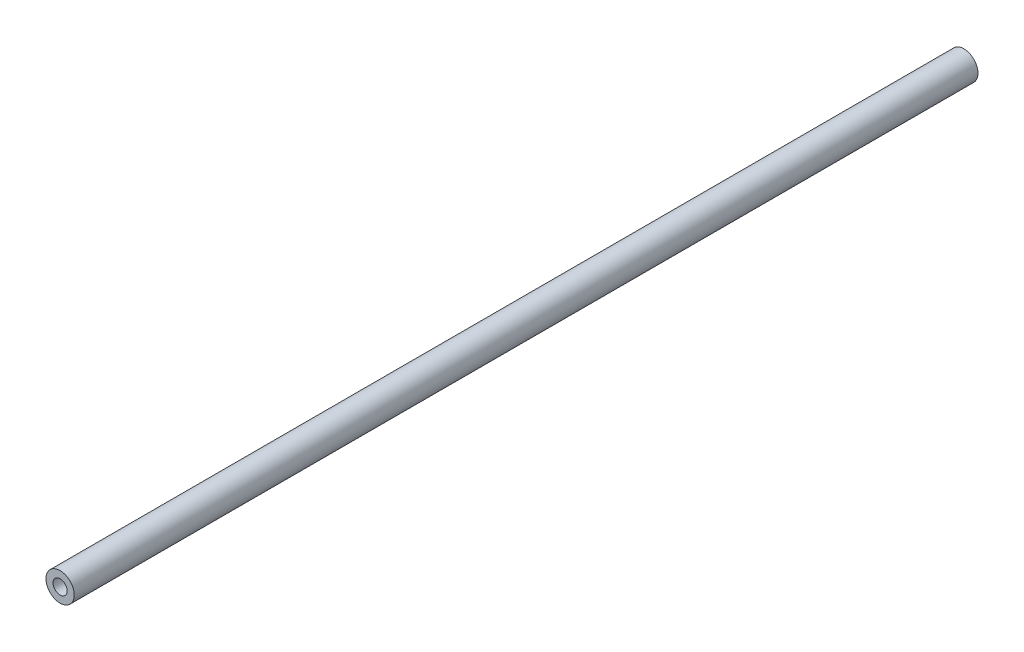
ISO-10303-21;
HEADER;
FILE_DESCRIPTION(('STEP AP214'),'2;1');
FILE_NAME('part.step','',(''),(''),'','','');
FILE_SCHEMA(('AUTOMOTIVE_DESIGN { 1 0 10303 214 1 1 1 1 }'));
ENDSEC;
DATA;
#1=APPLICATION_CONTEXT('core data for automotive mechanical design processes');
#2=APPLICATION_PROTOCOL_DEFINITION('international standard','automotive_design',2000,#1);
#3=PRODUCT_CONTEXT('',#1,'mechanical');
#4=PRODUCT('Part','Part','',(#3));
#5=PRODUCT_RELATED_PRODUCT_CATEGORY('part','',(#4));
#6=PRODUCT_DEFINITION_FORMATION('','',#4);
#7=PRODUCT_DEFINITION_CONTEXT('part definition',#1,'design');
#8=PRODUCT_DEFINITION('design','',#6,#7);
#9=PRODUCT_DEFINITION_SHAPE('','',#8);
#10=(LENGTH_UNIT() NAMED_UNIT(*) SI_UNIT(.MILLI.,.METRE.));
#11=(NAMED_UNIT(*) PLANE_ANGLE_UNIT() SI_UNIT($,.RADIAN.));
#12=(NAMED_UNIT(*) SI_UNIT($,.STERADIAN.) SOLID_ANGLE_UNIT());
#13=UNCERTAINTY_MEASURE_WITH_UNIT(LENGTH_MEASURE(1.E-05),#10,'distance_accuracy_value','');
#14=(GEOMETRIC_REPRESENTATION_CONTEXT(3) GLOBAL_UNCERTAINTY_ASSIGNED_CONTEXT((#13)) GLOBAL_UNIT_ASSIGNED_CONTEXT((#10,
#11,#12)) REPRESENTATION_CONTEXT('',''));
#15=CARTESIAN_POINT('',(0.,0.,0.));
#16=DIRECTION('',(0.,0.,1.));
#17=DIRECTION('',(1.,0.,0.));
#18=AXIS2_PLACEMENT_3D('',#15,#16,#17);
#19=CARTESIAN_POINT('',(0.,0.,406.4));
#20=DIRECTION('',(0.,0.,1.));
#21=DIRECTION('',(1.,0.,0.));
#22=AXIS2_PLACEMENT_3D('',#19,#20,#21);
#23=PLANE('',#22);
#24=CARTESIAN_POINT('',(0.,0.,406.4));
#25=DIRECTION('',(0.,0.,1.));
#26=DIRECTION('',(1.,0.,0.));
#27=AXIS2_PLACEMENT_3D('',#24,#25,#26);
#28=CIRCLE('',#27,6.35);
#29=CARTESIAN_POINT('',(6.35,0.,406.4));
#30=VERTEX_POINT('',#29);
#31=EDGE_CURVE('E10',#30,#30,#28,.T.);
#32=ORIENTED_EDGE('',*,*,#31,.T.);
#33=EDGE_LOOP('',(#32));
#34=FACE_BOUND('',#33,.T.);
#35=CARTESIAN_POINT('',(0.,0.,406.4));
#36=DIRECTION('',(0.,0.,1.));
#37=DIRECTION('',(1.,0.,0.));
#38=AXIS2_PLACEMENT_3D('',#35,#36,#37);
#39=CIRCLE('',#38,3.175);
#40=CARTESIAN_POINT('',(3.175,0.,406.4));
#41=VERTEX_POINT('',#40);
#42=EDGE_CURVE('E42',#41,#41,#39,.T.);
#43=ORIENTED_EDGE('',*,*,#42,.F.);
#44=EDGE_LOOP('',(#43));
#45=FACE_BOUND('',#44,.T.);
#46=ADVANCED_FACE('F31',(#34,#45),#23,.T.);
#47=CARTESIAN_POINT('',(0.,0.,0.));
#48=DIRECTION('',(0.,0.,1.));
#49=DIRECTION('',(1.,0.,0.));
#50=AXIS2_PLACEMENT_3D('',#47,#48,#49);
#51=PLANE('',#50);
#52=CARTESIAN_POINT('',(0.,0.,0.));
#53=DIRECTION('',(0.,0.,1.));
#54=DIRECTION('',(1.,0.,0.));
#55=AXIS2_PLACEMENT_3D('',#52,#53,#54);
#56=CIRCLE('',#55,6.35);
#57=CARTESIAN_POINT('',(6.35,0.,0.));
#58=VERTEX_POINT('',#57);
#59=EDGE_CURVE('E35',#58,#58,#56,.T.);
#60=ORIENTED_EDGE('',*,*,#59,.F.);
#61=EDGE_LOOP('',(#60));
#62=FACE_BOUND('',#61,.T.);
#63=CARTESIAN_POINT('',(0.,0.,0.));
#64=DIRECTION('',(0.,0.,1.));
#65=DIRECTION('',(1.,0.,0.));
#66=AXIS2_PLACEMENT_3D('',#63,#64,#65);
#67=CIRCLE('',#66,3.175);
#68=CARTESIAN_POINT('',(3.175,0.,0.));
#69=VERTEX_POINT('',#68);
#70=EDGE_CURVE('E44',#69,#69,#67,.T.);
#71=ORIENTED_EDGE('',*,*,#70,.T.);
#72=EDGE_LOOP('',(#71));
#73=FACE_BOUND('',#72,.T.);
#74=ADVANCED_FACE('F54',(#62,#73),#51,.F.);
#75=CARTESIAN_POINT('',(0.,0.,406.4));
#76=DIRECTION('',(0.,0.,-1.));
#77=DIRECTION('',(-1.,0.,0.));
#78=AXIS2_PLACEMENT_3D('',#75,#76,#77);
#79=CYLINDRICAL_SURFACE('',#78,6.35);
#80=ORIENTED_EDGE('',*,*,#31,.F.);
#81=EDGE_LOOP('',(#80));
#82=FACE_BOUND('',#81,.T.);
#83=ORIENTED_EDGE('',*,*,#59,.T.);
#84=EDGE_LOOP('',(#83));
#85=FACE_BOUND('',#84,.T.);
#86=ADVANCED_FACE('F33',(#82,#85),#79,.T.);
#87=CARTESIAN_POINT('',(0.,0.,406.4));
#88=DIRECTION('',(0.,0.,-1.));
#89=DIRECTION('',(-1.,0.,0.));
#90=AXIS2_PLACEMENT_3D('',#87,#88,#89);
#91=CYLINDRICAL_SURFACE('',#90,3.175);
#92=ORIENTED_EDGE('',*,*,#42,.T.);
#93=EDGE_LOOP('',(#92));
#94=FACE_BOUND('',#93,.T.);
#95=ORIENTED_EDGE('',*,*,#70,.F.);
#96=EDGE_LOOP('',(#95));
#97=FACE_BOUND('',#96,.T.);
#98=ADVANCED_FACE('F50',(#94,#97),#91,.F.);
#99=CLOSED_SHELL('',(#46,#74,#86,#98));
#100=MANIFOLD_SOLID_BREP('B2',#99);
#101=ADVANCED_BREP_SHAPE_REPRESENTATION('',(#18,#100),#14);
#102=SHAPE_DEFINITION_REPRESENTATION(#9,#101);
ENDSEC;
END-ISO-10303-21;
